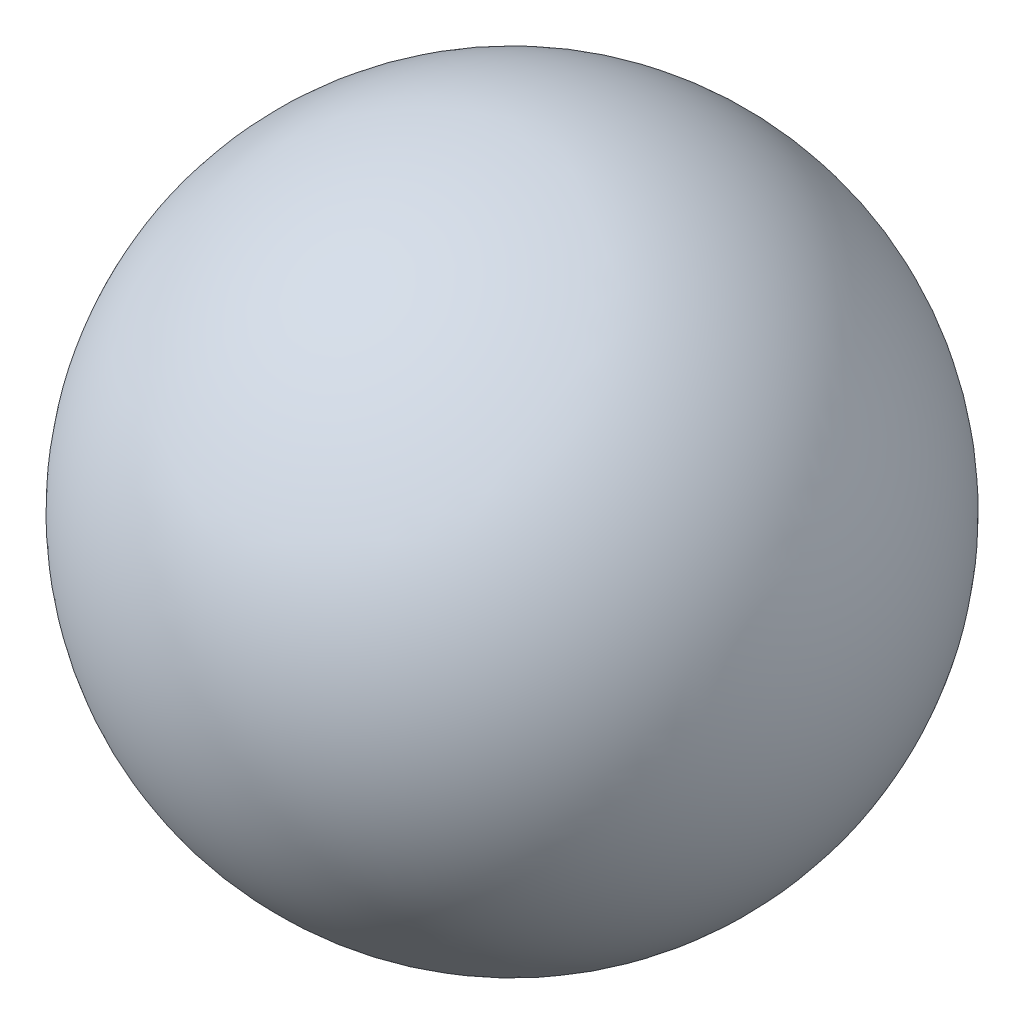
ISO-10303-21;
HEADER;
FILE_DESCRIPTION(('STEP AP214'),'2;1');
FILE_NAME('part.step','',(''),(''),'','','');
FILE_SCHEMA(('AUTOMOTIVE_DESIGN { 1 0 10303 214 1 1 1 1 }'));
ENDSEC;
DATA;
#1=APPLICATION_CONTEXT('core data for automotive mechanical design processes');
#2=APPLICATION_PROTOCOL_DEFINITION('international standard','automotive_design',2000,#1);
#3=PRODUCT_CONTEXT('',#1,'mechanical');
#4=PRODUCT('Part','Part','',(#3));
#5=PRODUCT_RELATED_PRODUCT_CATEGORY('part','',(#4));
#6=PRODUCT_DEFINITION_FORMATION('','',#4);
#7=PRODUCT_DEFINITION_CONTEXT('part definition',#1,'design');
#8=PRODUCT_DEFINITION('design','',#6,#7);
#9=PRODUCT_DEFINITION_SHAPE('','',#8);
#10=(LENGTH_UNIT() NAMED_UNIT(*) SI_UNIT(.MILLI.,.METRE.));
#11=(NAMED_UNIT(*) PLANE_ANGLE_UNIT() SI_UNIT($,.RADIAN.));
#12=(NAMED_UNIT(*) SI_UNIT($,.STERADIAN.) SOLID_ANGLE_UNIT());
#13=UNCERTAINTY_MEASURE_WITH_UNIT(LENGTH_MEASURE(1.E-05),#10,'distance_accuracy_value','');
#14=(GEOMETRIC_REPRESENTATION_CONTEXT(3) GLOBAL_UNCERTAINTY_ASSIGNED_CONTEXT((#13)) GLOBAL_UNIT_ASSIGNED_CONTEXT((#10,
#11,#12)) REPRESENTATION_CONTEXT('',''));
#15=CARTESIAN_POINT('',(0.,0.,0.));
#16=DIRECTION('',(0.,0.,1.));
#17=DIRECTION('',(1.,0.,0.));
#18=AXIS2_PLACEMENT_3D('',#15,#16,#17);
#19=CARTESIAN_POINT('',(0.,0.,0.));
#20=DIRECTION('',(1.,0.,0.));
#21=DIRECTION('',(0.,-1.,0.));
#22=AXIS2_PLACEMENT_3D('',#19,#20,#21);
#23=SPHERICAL_SURFACE('',#22,17.);
#24=CARTESIAN_POINT('',(17.,0.,0.));
#25=VERTEX_POINT('',#24);
#26=VERTEX_LOOP('',#25);
#27=FACE_BOUND('',#26,.T.);
#28=ADVANCED_FACE('F29',(#27),#23,.T.);
#29=CLOSED_SHELL('',(#28));
#30=MANIFOLD_SOLID_BREP('B2',#29);
#31=ADVANCED_BREP_SHAPE_REPRESENTATION('',(#18,#30),#14);
#32=SHAPE_DEFINITION_REPRESENTATION(#9,#31);
ENDSEC;
END-ISO-10303-21;
